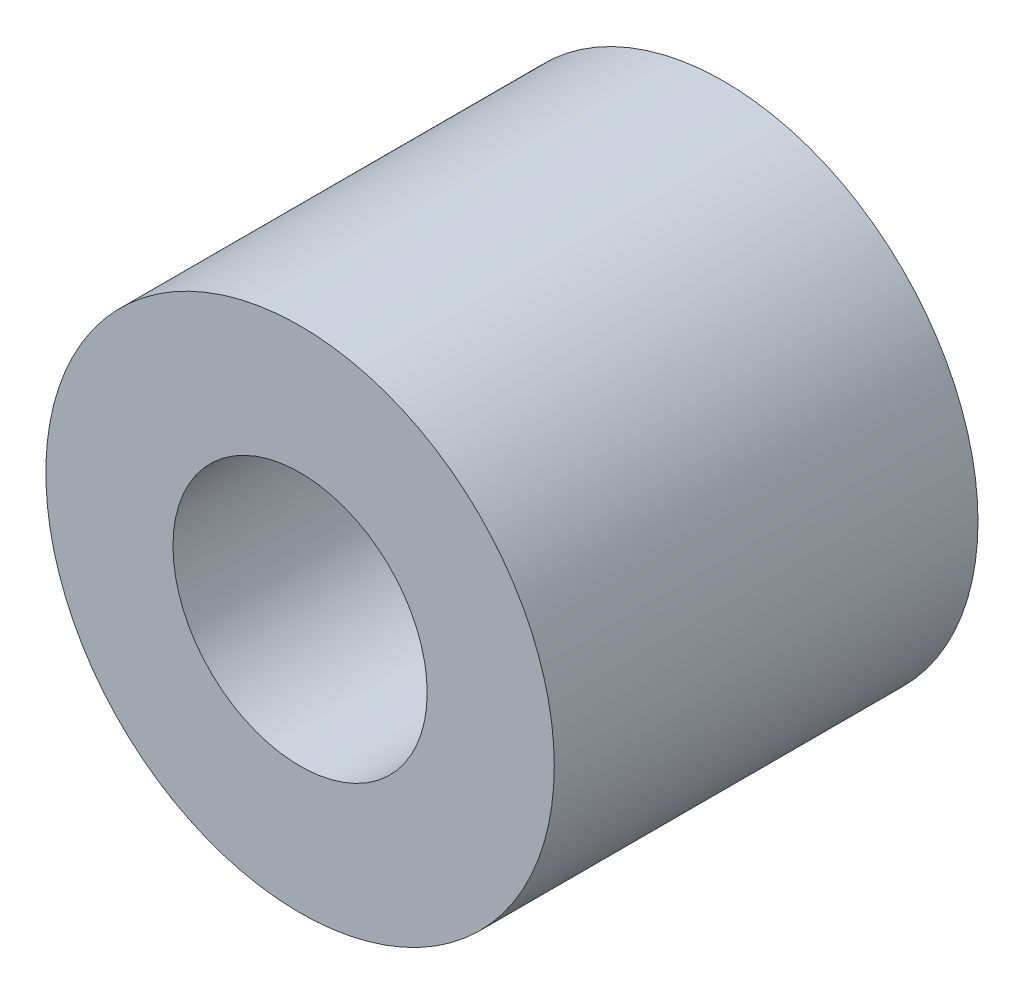
ISO-10303-21;
HEADER;
FILE_DESCRIPTION(('STEP AP214'),'2;1');
FILE_NAME('part.step','',(''),(''),'','','');
FILE_SCHEMA(('AUTOMOTIVE_DESIGN { 1 0 10303 214 1 1 1 1 }'));
ENDSEC;
DATA;
#1=APPLICATION_CONTEXT('core data for automotive mechanical design processes');
#2=APPLICATION_PROTOCOL_DEFINITION('international standard','automotive_design',2000,#1);
#3=PRODUCT_CONTEXT('',#1,'mechanical');
#4=PRODUCT('Part','Part','',(#3));
#5=PRODUCT_RELATED_PRODUCT_CATEGORY('part','',(#4));
#6=PRODUCT_DEFINITION_FORMATION('','',#4);
#7=PRODUCT_DEFINITION_CONTEXT('part definition',#1,'design');
#8=PRODUCT_DEFINITION('design','',#6,#7);
#9=PRODUCT_DEFINITION_SHAPE('','',#8);
#10=(LENGTH_UNIT() NAMED_UNIT(*) SI_UNIT(.MILLI.,.METRE.));
#11=(NAMED_UNIT(*) PLANE_ANGLE_UNIT() SI_UNIT($,.RADIAN.));
#12=(NAMED_UNIT(*) SI_UNIT($,.STERADIAN.) SOLID_ANGLE_UNIT());
#13=UNCERTAINTY_MEASURE_WITH_UNIT(LENGTH_MEASURE(1.E-05),#10,'distance_accuracy_value','');
#14=(GEOMETRIC_REPRESENTATION_CONTEXT(3) GLOBAL_UNCERTAINTY_ASSIGNED_CONTEXT((#13)) GLOBAL_UNIT_ASSIGNED_CONTEXT((#10,
#11,#12)) REPRESENTATION_CONTEXT('',''));
#15=CARTESIAN_POINT('',(0.,0.,0.));
#16=DIRECTION('',(0.,0.,1.));
#17=DIRECTION('',(1.,0.,0.));
#18=AXIS2_PLACEMENT_3D('',#15,#16,#17);
#19=CARTESIAN_POINT('',(0.,0.,0.));
#20=DIRECTION('',(0.,0.,1.));
#21=DIRECTION('',(1.,0.,0.));
#22=AXIS2_PLACEMENT_3D('',#19,#20,#21);
#23=CYLINDRICAL_SURFACE('',#22,3.);
#24=CARTESIAN_POINT('',(0.,0.,0.));
#25=DIRECTION('',(0.,0.,1.));
#26=DIRECTION('',(1.,0.,0.));
#27=AXIS2_PLACEMENT_3D('',#24,#25,#26);
#28=CIRCLE('',#27,3.);
#29=CARTESIAN_POINT('',(3.,0.,0.));
#30=VERTEX_POINT('',#29);
#31=EDGE_CURVE('E27',#30,#30,#28,.T.);
#32=ORIENTED_EDGE('',*,*,#31,.F.);
#33=EDGE_LOOP('',(#32));
#34=FACE_BOUND('',#33,.T.);
#35=CARTESIAN_POINT('',(0.,0.,10.));
#36=DIRECTION('',(0.,0.,1.));
#37=DIRECTION('',(1.,0.,0.));
#38=AXIS2_PLACEMENT_3D('',#35,#36,#37);
#39=CIRCLE('',#38,3.);
#40=CARTESIAN_POINT('',(3.,0.,10.));
#41=VERTEX_POINT('',#40);
#42=EDGE_CURVE('E18',#41,#41,#39,.T.);
#43=ORIENTED_EDGE('',*,*,#42,.T.);
#44=EDGE_LOOP('',(#43));
#45=FACE_BOUND('',#44,.T.);
#46=ADVANCED_FACE('F15',(#34,#45),#23,.F.);
#47=CARTESIAN_POINT('',(0.,0.,10.));
#48=DIRECTION('',(0.,0.,-1.));
#49=DIRECTION('',(-1.,0.,0.));
#50=AXIS2_PLACEMENT_3D('',#47,#48,#49);
#51=PLANE('',#50);
#52=ORIENTED_EDGE('',*,*,#42,.F.);
#53=EDGE_LOOP('',(#52));
#54=FACE_BOUND('',#53,.T.);
#55=CARTESIAN_POINT('',(0.,0.,10.));
#56=DIRECTION('',(0.,0.,1.));
#57=DIRECTION('',(1.,0.,0.));
#58=AXIS2_PLACEMENT_3D('',#55,#56,#57);
#59=CIRCLE('',#58,6.);
#60=CARTESIAN_POINT('',(6.,0.,10.));
#61=VERTEX_POINT('',#60);
#62=EDGE_CURVE('E22',#61,#61,#59,.F.);
#63=ORIENTED_EDGE('',*,*,#62,.F.);
#64=EDGE_LOOP('',(#63));
#65=FACE_BOUND('',#64,.T.);
#66=ADVANCED_FACE('F36',(#54,#65),#51,.F.);
#67=CARTESIAN_POINT('',(0.,0.,0.));
#68=DIRECTION('',(0.,0.,-1.));
#69=DIRECTION('',(-1.,0.,0.));
#70=AXIS2_PLACEMENT_3D('',#67,#68,#69);
#71=PLANE('',#70);
#72=ORIENTED_EDGE('',*,*,#31,.T.);
#73=EDGE_LOOP('',(#72));
#74=FACE_BOUND('',#73,.T.);
#75=CARTESIAN_POINT('',(0.,0.,0.));
#76=DIRECTION('',(0.,0.,1.));
#77=DIRECTION('',(1.,0.,0.));
#78=AXIS2_PLACEMENT_3D('',#75,#76,#77);
#79=CIRCLE('',#78,6.);
#80=CARTESIAN_POINT('',(6.,0.,0.));
#81=VERTEX_POINT('',#80);
#82=EDGE_CURVE('E10',#81,#81,#79,.T.);
#83=ORIENTED_EDGE('',*,*,#82,.F.);
#84=EDGE_LOOP('',(#83));
#85=FACE_BOUND('',#84,.T.);
#86=ADVANCED_FACE('F39',(#74,#85),#71,.T.);
#87=CARTESIAN_POINT('',(0.,0.,0.));
#88=DIRECTION('',(0.,0.,1.));
#89=DIRECTION('',(1.,0.,0.));
#90=AXIS2_PLACEMENT_3D('',#87,#88,#89);
#91=CYLINDRICAL_SURFACE('',#90,6.);
#92=ORIENTED_EDGE('',*,*,#82,.T.);
#93=EDGE_LOOP('',(#92));
#94=FACE_BOUND('',#93,.T.);
#95=ORIENTED_EDGE('',*,*,#62,.T.);
#96=EDGE_LOOP('',(#95));
#97=FACE_BOUND('',#96,.T.);
#98=ADVANCED_FACE('F42',(#94,#97),#91,.T.);
#99=CLOSED_SHELL('',(#46,#66,#86,#98));
#100=MANIFOLD_SOLID_BREP('B1',#99);
#101=ADVANCED_BREP_SHAPE_REPRESENTATION('',(#18,#100),#14);
#102=SHAPE_DEFINITION_REPRESENTATION(#9,#101);
ENDSEC;
END-ISO-10303-21;
